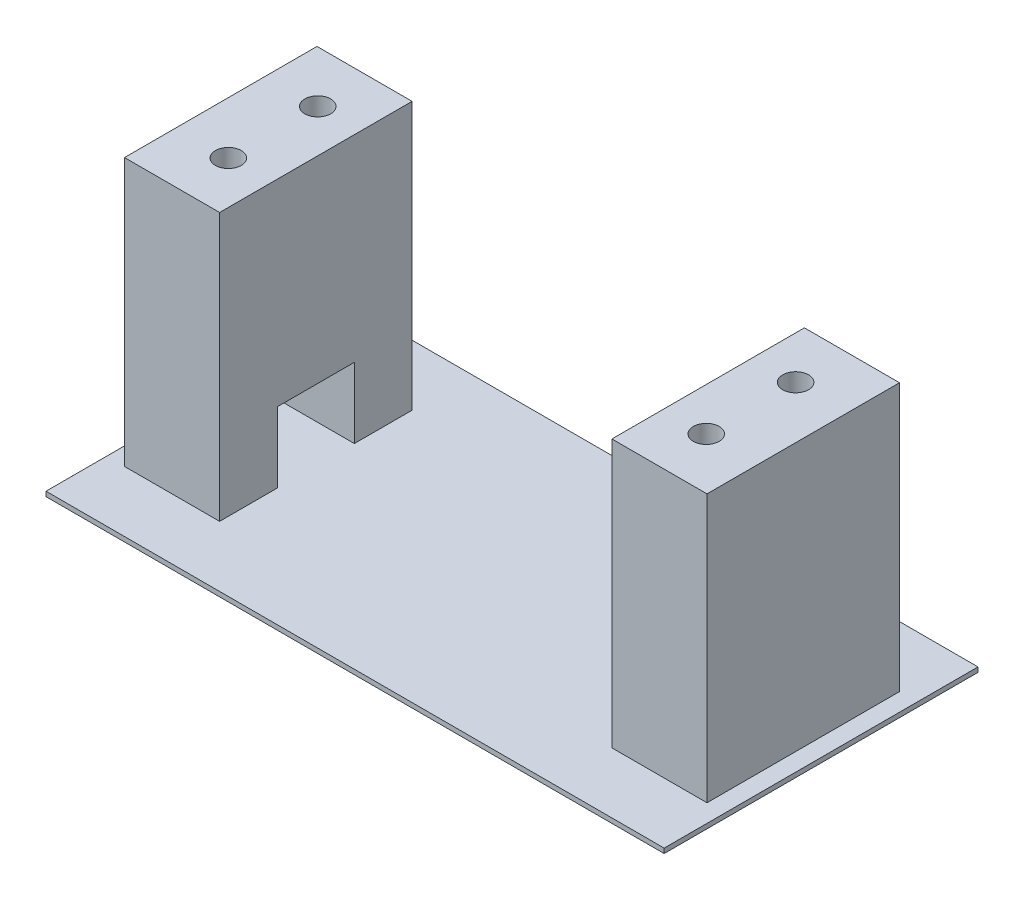
ISO-10303-21;
HEADER;
FILE_DESCRIPTION(('STEP AP214'),'2;1');
FILE_NAME('part.step','',(''),(''),'','','');
FILE_SCHEMA(('AUTOMOTIVE_DESIGN { 1 0 10303 214 1 1 1 1 }'));
ENDSEC;
DATA;
#1=APPLICATION_CONTEXT('core data for automotive mechanical design processes');
#2=APPLICATION_PROTOCOL_DEFINITION('international standard','automotive_design',2000,#1);
#3=PRODUCT_CONTEXT('',#1,'mechanical');
#4=PRODUCT('Part','Part','',(#3));
#5=PRODUCT_RELATED_PRODUCT_CATEGORY('part','',(#4));
#6=PRODUCT_DEFINITION_FORMATION('','',#4);
#7=PRODUCT_DEFINITION_CONTEXT('part definition',#1,'design');
#8=PRODUCT_DEFINITION('design','',#6,#7);
#9=PRODUCT_DEFINITION_SHAPE('','',#8);
#10=(LENGTH_UNIT() NAMED_UNIT(*) SI_UNIT(.MILLI.,.METRE.));
#11=(NAMED_UNIT(*) PLANE_ANGLE_UNIT() SI_UNIT($,.RADIAN.));
#12=(NAMED_UNIT(*) SI_UNIT($,.STERADIAN.) SOLID_ANGLE_UNIT());
#13=UNCERTAINTY_MEASURE_WITH_UNIT(LENGTH_MEASURE(1.E-05),#10,'distance_accuracy_value','');
#14=(GEOMETRIC_REPRESENTATION_CONTEXT(3) GLOBAL_UNCERTAINTY_ASSIGNED_CONTEXT((#13)) GLOBAL_UNIT_ASSIGNED_CONTEXT((#10,
#11,#12)) REPRESENTATION_CONTEXT('',''));
#15=CARTESIAN_POINT('',(0.,0.,0.));
#16=DIRECTION('',(0.,0.,1.));
#17=DIRECTION('',(1.,0.,0.));
#18=AXIS2_PLACEMENT_3D('',#15,#16,#17);
#19=CARTESIAN_POINT('',(0.,0.5,0.));
#20=DIRECTION('',(0.,-1.,0.));
#21=DIRECTION('',(0.,0.,-1.));
#22=AXIS2_PLACEMENT_3D('',#19,#20,#21);
#23=PLANE('',#22);
#24=DIRECTION('',(-1.,0.,0.));
#25=VECTOR('',#24,1.);
#26=CARTESIAN_POINT('',(32.501,0.5,4.05));
#27=LINE('',#26,#25);
#28=CARTESIAN_POINT('',(-20.625,0.5,4.05));
#29=VERTEX_POINT('',#28);
#30=CARTESIAN_POINT('',(-30.625,0.5,4.05));
#31=VERTEX_POINT('',#30);
#32=EDGE_CURVE('E68',#29,#31,#27,.T.);
#33=ORIENTED_EDGE('',*,*,#32,.F.);
#34=DIRECTION('',(0.,0.,1.));
#35=VECTOR('',#34,1.);
#36=CARTESIAN_POINT('',(-20.625,0.5,-10.12));
#37=LINE('',#36,#35);
#38=CARTESIAN_POINT('',(-20.625,0.5,10.12));
#39=VERTEX_POINT('',#38);
#40=EDGE_CURVE('E232',#29,#39,#37,.T.);
#41=ORIENTED_EDGE('',*,*,#40,.T.);
#42=DIRECTION('',(-1.,0.,0.));
#43=VECTOR('',#42,1.);
#44=CARTESIAN_POINT('',(-20.625,0.5,10.12));
#45=LINE('',#44,#43);
#46=CARTESIAN_POINT('',(-30.625,0.5,10.12));
#47=VERTEX_POINT('',#46);
#48=EDGE_CURVE('E228',#39,#47,#45,.T.);
#49=ORIENTED_EDGE('',*,*,#48,.T.);
#50=DIRECTION('',(0.,0.,1.));
#51=VECTOR('',#50,1.);
#52=CARTESIAN_POINT('',(-30.625,0.5,-10.12));
#53=LINE('',#52,#51);
#54=EDGE_CURVE('E240',#31,#47,#53,.T.);
#55=ORIENTED_EDGE('',*,*,#54,.F.);
#56=EDGE_LOOP('',(#33,#41,#49,#55));
#57=FACE_BOUND('',#56,.T.);
#58=CARTESIAN_POINT('',(-20.625,0.5,-10.12));
#59=VERTEX_POINT('',#58);
#60=CARTESIAN_POINT('',(-20.625,0.5,-4.05));
#61=VERTEX_POINT('',#60);
#62=EDGE_CURVE('E233',#59,#61,#37,.T.);
#63=ORIENTED_EDGE('',*,*,#62,.T.);
#64=DIRECTION('',(-1.,0.,0.));
#65=VECTOR('',#64,1.);
#66=CARTESIAN_POINT('',(32.501,0.5,-4.05));
#67=LINE('',#66,#65);
#68=CARTESIAN_POINT('',(-30.625,0.5,-4.05));
#69=VERTEX_POINT('',#68);
#70=EDGE_CURVE('E165',#61,#69,#67,.T.);
#71=ORIENTED_EDGE('',*,*,#70,.T.);
#72=CARTESIAN_POINT('',(-30.625,0.5,-10.12));
#73=VERTEX_POINT('',#72);
#74=EDGE_CURVE('E217',#73,#69,#53,.T.);
#75=ORIENTED_EDGE('',*,*,#74,.F.);
#76=DIRECTION('',(-1.,0.,0.));
#77=VECTOR('',#76,1.);
#78=CARTESIAN_POINT('',(-20.625,0.5,-10.12));
#79=LINE('',#78,#77);
#80=EDGE_CURVE('E236',#59,#73,#79,.T.);
#81=ORIENTED_EDGE('',*,*,#80,.F.);
#82=EDGE_LOOP('',(#63,#71,#75,#81));
#83=FACE_BOUND('',#82,.T.);
#84=DIRECTION('',(0.,0.,-1.));
#85=VECTOR('',#84,1.);
#86=CARTESIAN_POINT('',(32.5,0.5,16.5));
#87=LINE('',#86,#85);
#88=CARTESIAN_POINT('',(32.5,0.5,16.5));
#89=VERTEX_POINT('',#88);
#90=CARTESIAN_POINT('',(32.5,0.5,-16.5));
#91=VERTEX_POINT('',#90);
#92=EDGE_CURVE('E314',#89,#91,#87,.T.);
#93=ORIENTED_EDGE('',*,*,#92,.T.);
#94=DIRECTION('',(-1.,0.,0.));
#95=VECTOR('',#94,1.);
#96=CARTESIAN_POINT('',(-32.5,0.5,-16.5));
#97=LINE('',#96,#95);
#98=CARTESIAN_POINT('',(-32.5,0.5,-16.5));
#99=VERTEX_POINT('',#98);
#100=EDGE_CURVE('E318',#91,#99,#97,.T.);
#101=ORIENTED_EDGE('',*,*,#100,.T.);
#102=DIRECTION('',(0.,0.,1.));
#103=VECTOR('',#102,1.);
#104=CARTESIAN_POINT('',(-32.5,0.5,16.5));
#105=LINE('',#104,#103);
#106=CARTESIAN_POINT('',(-32.5,0.5,16.5));
#107=VERTEX_POINT('',#106);
#108=EDGE_CURVE('E322',#99,#107,#105,.T.);
#109=ORIENTED_EDGE('',*,*,#108,.T.);
#110=DIRECTION('',(1.,0.,0.));
#111=VECTOR('',#110,1.);
#112=CARTESIAN_POINT('',(-32.5,0.5,16.5));
#113=LINE('',#112,#111);
#114=EDGE_CURVE('E325',#107,#89,#113,.T.);
#115=ORIENTED_EDGE('',*,*,#114,.T.);
#116=EDGE_LOOP('',(#93,#101,#109,#115));
#117=FACE_BOUND('',#116,.T.);
#118=DIRECTION('',(1.,0.,0.));
#119=VECTOR('',#118,1.);
#120=CARTESIAN_POINT('',(20.625,0.5,10.12));
#121=LINE('',#120,#119);
#122=CARTESIAN_POINT('',(20.625,0.5,10.12));
#123=VERTEX_POINT('',#122);
#124=CARTESIAN_POINT('',(30.625,0.5,10.12));
#125=VERTEX_POINT('',#124);
#126=EDGE_CURVE('E284',#123,#125,#121,.T.);
#127=ORIENTED_EDGE('',*,*,#126,.F.);
#128=DIRECTION('',(0.,0.,1.));
#129=VECTOR('',#128,1.);
#130=CARTESIAN_POINT('',(20.625,0.5,-10.12));
#131=LINE('',#130,#129);
#132=CARTESIAN_POINT('',(20.625,0.5,-10.12));
#133=VERTEX_POINT('',#132);
#134=EDGE_CURVE('E272',#133,#123,#131,.T.);
#135=ORIENTED_EDGE('',*,*,#134,.F.);
#136=DIRECTION('',(1.,0.,0.));
#137=VECTOR('',#136,1.);
#138=CARTESIAN_POINT('',(20.625,0.5,-10.12));
#139=LINE('',#138,#137);
#140=CARTESIAN_POINT('',(30.625,0.5,-10.12));
#141=VERTEX_POINT('',#140);
#142=EDGE_CURVE('E292',#133,#141,#139,.T.);
#143=ORIENTED_EDGE('',*,*,#142,.T.);
#144=DIRECTION('',(0.,0.,1.));
#145=VECTOR('',#144,1.);
#146=CARTESIAN_POINT('',(30.625,0.5,-10.12));
#147=LINE('',#146,#145);
#148=EDGE_CURVE('E288',#141,#125,#147,.T.);
#149=ORIENTED_EDGE('',*,*,#148,.T.);
#150=EDGE_LOOP('',(#127,#135,#143,#149));
#151=FACE_BOUND('',#150,.T.);
#152=ADVANCED_FACE('F45',(#57,#83,#117,#151),#23,.F.);
#153=CARTESIAN_POINT('',(32.5,0.5,16.5));
#154=DIRECTION('',(-1.,0.,0.));
#155=DIRECTION('',(0.,0.,1.));
#156=AXIS2_PLACEMENT_3D('',#153,#154,#155);
#157=PLANE('',#156);
#158=DIRECTION('',(0.,0.,-1.));
#159=VECTOR('',#158,1.);
#160=CARTESIAN_POINT('',(32.5,0.,16.5));
#161=LINE('',#160,#159);
#162=CARTESIAN_POINT('',(32.5,0.,16.5));
#163=VERTEX_POINT('',#162);
#164=CARTESIAN_POINT('',(32.5,0.,-16.5));
#165=VERTEX_POINT('',#164);
#166=EDGE_CURVE('E313',#163,#165,#161,.T.);
#167=ORIENTED_EDGE('',*,*,#166,.T.);
#168=DIRECTION('',(0.,-1.,0.));
#169=VECTOR('',#168,1.);
#170=CARTESIAN_POINT('',(32.5,0.5,-16.5));
#171=LINE('',#170,#169);
#172=EDGE_CURVE('E11',#91,#165,#171,.T.);
#173=ORIENTED_EDGE('',*,*,#172,.F.);
#174=ORIENTED_EDGE('',*,*,#92,.F.);
#175=DIRECTION('',(0.,-1.,0.));
#176=VECTOR('',#175,1.);
#177=CARTESIAN_POINT('',(32.5,0.5,16.5));
#178=LINE('',#177,#176);
#179=EDGE_CURVE('E328',#89,#163,#178,.T.);
#180=ORIENTED_EDGE('',*,*,#179,.T.);
#181=EDGE_LOOP('',(#167,#173,#174,#180));
#182=FACE_BOUND('',#181,.T.);
#183=ADVANCED_FACE('F47',(#182),#157,.F.);
#184=CARTESIAN_POINT('',(-32.5,0.5,-16.5));
#185=DIRECTION('',(0.,0.,1.));
#186=DIRECTION('',(1.,0.,0.));
#187=AXIS2_PLACEMENT_3D('',#184,#185,#186);
#188=PLANE('',#187);
#189=DIRECTION('',(-1.,0.,0.));
#190=VECTOR('',#189,1.);
#191=CARTESIAN_POINT('',(-32.5,0.,-16.5));
#192=LINE('',#191,#190);
#193=CARTESIAN_POINT('',(-32.5,0.,-16.5));
#194=VERTEX_POINT('',#193);
#195=EDGE_CURVE('E332',#165,#194,#192,.T.);
#196=ORIENTED_EDGE('',*,*,#195,.T.);
#197=DIRECTION('',(0.,-1.,0.));
#198=VECTOR('',#197,1.);
#199=CARTESIAN_POINT('',(-32.5,0.5,-16.5));
#200=LINE('',#199,#198);
#201=EDGE_CURVE('E55',#99,#194,#200,.T.);
#202=ORIENTED_EDGE('',*,*,#201,.F.);
#203=ORIENTED_EDGE('',*,*,#100,.F.);
#204=ORIENTED_EDGE('',*,*,#172,.T.);
#205=EDGE_LOOP('',(#196,#202,#203,#204));
#206=FACE_BOUND('',#205,.T.);
#207=ADVANCED_FACE('F387',(#206),#188,.F.);
#208=CARTESIAN_POINT('',(-32.5,0.5,16.5));
#209=DIRECTION('',(1.,0.,0.));
#210=DIRECTION('',(0.,0.,-1.));
#211=AXIS2_PLACEMENT_3D('',#208,#209,#210);
#212=PLANE('',#211);
#213=DIRECTION('',(0.,0.,1.));
#214=VECTOR('',#213,1.);
#215=CARTESIAN_POINT('',(-32.5,0.,16.5));
#216=LINE('',#215,#214);
#217=CARTESIAN_POINT('',(-32.5,0.,16.5));
#218=VERTEX_POINT('',#217);
#219=EDGE_CURVE('E335',#194,#218,#216,.T.);
#220=ORIENTED_EDGE('',*,*,#219,.T.);
#221=DIRECTION('',(0.,-1.,0.));
#222=VECTOR('',#221,1.);
#223=CARTESIAN_POINT('',(-32.5,0.5,16.5));
#224=LINE('',#223,#222);
#225=EDGE_CURVE('E343',#107,#218,#224,.T.);
#226=ORIENTED_EDGE('',*,*,#225,.F.);
#227=ORIENTED_EDGE('',*,*,#108,.F.);
#228=ORIENTED_EDGE('',*,*,#201,.T.);
#229=EDGE_LOOP('',(#220,#226,#227,#228));
#230=FACE_BOUND('',#229,.T.);
#231=ADVANCED_FACE('F401',(#230),#212,.F.);
#232=CARTESIAN_POINT('',(-32.5,0.5,16.5));
#233=DIRECTION('',(0.,0.,-1.));
#234=DIRECTION('',(-1.,0.,0.));
#235=AXIS2_PLACEMENT_3D('',#232,#233,#234);
#236=PLANE('',#235);
#237=DIRECTION('',(1.,0.,0.));
#238=VECTOR('',#237,1.);
#239=CARTESIAN_POINT('',(-32.5,0.,16.5));
#240=LINE('',#239,#238);
#241=EDGE_CURVE('E319',#218,#163,#240,.T.);
#242=ORIENTED_EDGE('',*,*,#241,.T.);
#243=ORIENTED_EDGE('',*,*,#179,.F.);
#244=ORIENTED_EDGE('',*,*,#114,.F.);
#245=ORIENTED_EDGE('',*,*,#225,.T.);
#246=EDGE_LOOP('',(#242,#243,#244,#245));
#247=FACE_BOUND('',#246,.T.);
#248=ADVANCED_FACE('F397',(#247),#236,.F.);
#249=CARTESIAN_POINT('',(0.,0.,0.));
#250=DIRECTION('',(0.,-1.,0.));
#251=DIRECTION('',(0.,0.,-1.));
#252=AXIS2_PLACEMENT_3D('',#249,#250,#251);
#253=PLANE('',#252);
#254=ORIENTED_EDGE('',*,*,#166,.F.);
#255=ORIENTED_EDGE('',*,*,#241,.F.);
#256=ORIENTED_EDGE('',*,*,#219,.F.);
#257=ORIENTED_EDGE('',*,*,#195,.F.);
#258=EDGE_LOOP('',(#254,#255,#256,#257));
#259=FACE_BOUND('',#258,.T.);
#260=ADVANCED_FACE('F394',(#259),#253,.T.);
#261=CARTESIAN_POINT('',(20.625,28.63,10.12));
#262=DIRECTION('',(0.,0.,-1.));
#263=DIRECTION('',(-1.,0.,0.));
#264=AXIS2_PLACEMENT_3D('',#261,#262,#263);
#265=PLANE('',#264);
#266=ORIENTED_EDGE('',*,*,#126,.T.);
#267=DIRECTION('',(0.,-1.,0.));
#268=VECTOR('',#267,1.);
#269=CARTESIAN_POINT('',(30.625,28.63,10.12));
#270=LINE('',#269,#268);
#271=CARTESIAN_POINT('',(30.625,28.63,10.12));
#272=VERTEX_POINT('',#271);
#273=EDGE_CURVE('E309',#272,#125,#270,.T.);
#274=ORIENTED_EDGE('',*,*,#273,.F.);
#275=DIRECTION('',(1.,0.,0.));
#276=VECTOR('',#275,1.);
#277=CARTESIAN_POINT('',(20.625,28.63,10.12));
#278=LINE('',#277,#276);
#279=CARTESIAN_POINT('',(20.625,28.63,10.12));
#280=VERTEX_POINT('',#279);
#281=EDGE_CURVE('E268',#280,#272,#278,.T.);
#282=ORIENTED_EDGE('',*,*,#281,.F.);
#283=DIRECTION('',(0.,-1.,0.));
#284=VECTOR('',#283,1.);
#285=CARTESIAN_POINT('',(20.625,28.63,10.12));
#286=LINE('',#285,#284);
#287=EDGE_CURVE('E283',#280,#123,#286,.T.);
#288=ORIENTED_EDGE('',*,*,#287,.T.);
#289=EDGE_LOOP('',(#266,#274,#282,#288));
#290=FACE_BOUND('',#289,.T.);
#291=ADVANCED_FACE('F392',(#290),#265,.F.);
#292=CARTESIAN_POINT('',(30.625,28.63,-10.12));
#293=DIRECTION('',(1.,0.,0.));
#294=DIRECTION('',(0.,0.,-1.));
#295=AXIS2_PLACEMENT_3D('',#292,#293,#294);
#296=PLANE('',#295);
#297=ORIENTED_EDGE('',*,*,#148,.F.);
#298=DIRECTION('',(0.,-1.,0.));
#299=VECTOR('',#298,1.);
#300=CARTESIAN_POINT('',(30.625,28.63,-10.12));
#301=LINE('',#300,#299);
#302=CARTESIAN_POINT('',(30.625,28.63,-10.12));
#303=VERTEX_POINT('',#302);
#304=EDGE_CURVE('E305',#303,#141,#301,.T.);
#305=ORIENTED_EDGE('',*,*,#304,.F.);
#306=DIRECTION('',(0.,0.,1.));
#307=VECTOR('',#306,1.);
#308=CARTESIAN_POINT('',(30.625,28.63,-10.12));
#309=LINE('',#308,#307);
#310=EDGE_CURVE('E271',#303,#272,#309,.T.);
#311=ORIENTED_EDGE('',*,*,#310,.T.);
#312=ORIENTED_EDGE('',*,*,#273,.T.);
#313=EDGE_LOOP('',(#297,#305,#311,#312));
#314=FACE_BOUND('',#313,.T.);
#315=ADVANCED_FACE('F437',(#314),#296,.T.);
#316=CARTESIAN_POINT('',(20.625,28.63,-10.12));
#317=DIRECTION('',(0.,0.,-1.));
#318=DIRECTION('',(-1.,0.,0.));
#319=AXIS2_PLACEMENT_3D('',#316,#317,#318);
#320=PLANE('',#319);
#321=ORIENTED_EDGE('',*,*,#142,.F.);
#322=DIRECTION('',(0.,-1.,0.));
#323=VECTOR('',#322,1.);
#324=CARTESIAN_POINT('',(20.625,28.63,-10.12));
#325=LINE('',#324,#323);
#326=CARTESIAN_POINT('',(20.625,28.63,-10.12));
#327=VERTEX_POINT('',#326);
#328=EDGE_CURVE('E301',#327,#133,#325,.T.);
#329=ORIENTED_EDGE('',*,*,#328,.F.);
#330=DIRECTION('',(1.,0.,0.));
#331=VECTOR('',#330,1.);
#332=CARTESIAN_POINT('',(20.625,28.63,-10.12));
#333=LINE('',#332,#331);
#334=EDGE_CURVE('E276',#327,#303,#333,.T.);
#335=ORIENTED_EDGE('',*,*,#334,.T.);
#336=ORIENTED_EDGE('',*,*,#304,.T.);
#337=EDGE_LOOP('',(#321,#329,#335,#336));
#338=FACE_BOUND('',#337,.T.);
#339=ADVANCED_FACE('F435',(#338),#320,.T.);
#340=CARTESIAN_POINT('',(20.625,28.63,-10.12));
#341=DIRECTION('',(1.,0.,0.));
#342=DIRECTION('',(0.,0.,-1.));
#343=AXIS2_PLACEMENT_3D('',#340,#341,#342);
#344=PLANE('',#343);
#345=ORIENTED_EDGE('',*,*,#134,.T.);
#346=ORIENTED_EDGE('',*,*,#287,.F.);
#347=DIRECTION('',(0.,0.,1.));
#348=VECTOR('',#347,1.);
#349=CARTESIAN_POINT('',(20.625,28.63,-10.12));
#350=LINE('',#349,#348);
#351=EDGE_CURVE('E280',#327,#280,#350,.T.);
#352=ORIENTED_EDGE('',*,*,#351,.F.);
#353=ORIENTED_EDGE('',*,*,#328,.T.);
#354=EDGE_LOOP('',(#345,#346,#352,#353));
#355=FACE_BOUND('',#354,.T.);
#356=ADVANCED_FACE('F426',(#355),#344,.F.);
#357=CARTESIAN_POINT('',(0.,28.63,0.));
#358=DIRECTION('',(0.,-1.,0.));
#359=DIRECTION('',(0.,0.,-1.));
#360=AXIS2_PLACEMENT_3D('',#357,#358,#359);
#361=PLANE('',#360);
#362=CARTESIAN_POINT('',(25.125,28.63,-4.7));
#363=DIRECTION('',(0.,-1.,0.));
#364=DIRECTION('',(0.,0.,-1.));
#365=AXIS2_PLACEMENT_3D('',#362,#363,#364);
#366=CIRCLE('',#365,1.36107779506048);
#367=CARTESIAN_POINT('',(25.125,28.63,-6.06107779506048));
#368=VERTEX_POINT('',#367);
#369=EDGE_CURVE('E289',#368,#368,#366,.F.);
#370=ORIENTED_EDGE('',*,*,#369,.F.);
#371=EDGE_LOOP('',(#370));
#372=FACE_BOUND('',#371,.T.);
#373=CARTESIAN_POINT('',(25.125,28.63,4.7));
#374=DIRECTION('',(0.,-1.,0.));
#375=DIRECTION('',(0.,0.,-1.));
#376=AXIS2_PLACEMENT_3D('',#373,#374,#375);
#377=CIRCLE('',#376,1.36107779506048);
#378=CARTESIAN_POINT('',(25.125,28.63,3.33892220493952));
#379=VERTEX_POINT('',#378);
#380=EDGE_CURVE('E264',#379,#379,#377,.F.);
#381=ORIENTED_EDGE('',*,*,#380,.F.);
#382=EDGE_LOOP('',(#381));
#383=FACE_BOUND('',#382,.T.);
#384=ORIENTED_EDGE('',*,*,#281,.T.);
#385=ORIENTED_EDGE('',*,*,#310,.F.);
#386=ORIENTED_EDGE('',*,*,#334,.F.);
#387=ORIENTED_EDGE('',*,*,#351,.T.);
#388=EDGE_LOOP('',(#384,#385,#386,#387));
#389=FACE_BOUND('',#388,.T.);
#390=ADVANCED_FACE('F432',(#372,#383,#389),#361,.F.);
#391=CARTESIAN_POINT('',(25.125,28.630012,4.7));
#392=DIRECTION('',(0.,-1.,0.));
#393=DIRECTION('',(0.,0.,-1.));
#394=AXIS2_PLACEMENT_3D('',#391,#392,#393);
#395=CYLINDRICAL_SURFACE('',#394,1.36107779506048);
#396=CARTESIAN_POINT('',(25.125,18.63,4.7));
#397=DIRECTION('',(0.,1.,0.));
#398=DIRECTION('',(0.,0.,-1.));
#399=AXIS2_PLACEMENT_3D('',#396,#397,#398);
#400=CIRCLE('',#399,1.36107779506048);
#401=CARTESIAN_POINT('',(25.125,18.63,3.33892220493952));
#402=VERTEX_POINT('',#401);
#403=EDGE_CURVE('E259',#402,#402,#400,.T.);
#404=CARTESIAN_POINT('',(25.125,18.63,3.33892220493952));
#405=CARTESIAN_POINT('',(25.125,18.7341666666667,3.33892220493952));
#406=CARTESIAN_POINT('',(25.125,18.8383333333333,3.33892220493952));
#407=CARTESIAN_POINT('',(25.125,19.0466666666667,3.33892220493952));
#408=CARTESIAN_POINT('',(25.125,19.1508333333333,3.33892220493952));
#409=CARTESIAN_POINT('',(25.125,19.3591666666667,3.33892220493952));
#410=CARTESIAN_POINT('',(25.125,19.4633333333333,3.33892220493952));
#411=CARTESIAN_POINT('',(25.125,19.6716666666667,3.33892220493952));
#412=CARTESIAN_POINT('',(25.125,19.7758333333333,3.33892220493952));
#413=CARTESIAN_POINT('',(25.125,19.9841666666667,3.33892220493952));
#414=CARTESIAN_POINT('',(25.125,20.0883333333333,3.33892220493952));
#415=CARTESIAN_POINT('',(25.125,20.2966666666667,3.33892220493952));
#416=CARTESIAN_POINT('',(25.125,20.4008333333333,3.33892220493952));
#417=CARTESIAN_POINT('',(25.125,20.6091666666667,3.33892220493952));
#418=CARTESIAN_POINT('',(25.125,20.7133333333333,3.33892220493952));
#419=CARTESIAN_POINT('',(25.125,20.9216666666667,3.33892220493952));
#420=CARTESIAN_POINT('',(25.125,21.0258333333333,3.33892220493952));
#421=CARTESIAN_POINT('',(25.125,21.2341666666667,3.33892220493952));
#422=CARTESIAN_POINT('',(25.125,21.3383333333333,3.33892220493952));
#423=CARTESIAN_POINT('',(25.125,21.5466666666667,3.33892220493952));
#424=CARTESIAN_POINT('',(25.125,21.6508333333333,3.33892220493952));
#425=CARTESIAN_POINT('',(25.125,21.8591666666667,3.33892220493952));
#426=CARTESIAN_POINT('',(25.125,21.9633333333333,3.33892220493952));
#427=CARTESIAN_POINT('',(25.125,22.1716666666667,3.33892220493952));
#428=CARTESIAN_POINT('',(25.125,22.2758333333333,3.33892220493952));
#429=CARTESIAN_POINT('',(25.125,22.4841666666667,3.33892220493952));
#430=CARTESIAN_POINT('',(25.125,22.5883333333333,3.33892220493952));
#431=CARTESIAN_POINT('',(25.125,22.7966666666667,3.33892220493952));
#432=CARTESIAN_POINT('',(25.125,22.9008333333333,3.33892220493952));
#433=CARTESIAN_POINT('',(25.125,23.1091666666667,3.33892220493952));
#434=CARTESIAN_POINT('',(25.125,23.2133333333333,3.33892220493952));
#435=CARTESIAN_POINT('',(25.125,23.4216666666667,3.33892220493952));
#436=CARTESIAN_POINT('',(25.125,23.5258333333333,3.33892220493952));
#437=CARTESIAN_POINT('',(25.125,23.7341666666667,3.33892220493952));
#438=CARTESIAN_POINT('',(25.125,23.8383333333333,3.33892220493952));
#439=CARTESIAN_POINT('',(25.125,24.0466666666667,3.33892220493952));
#440=CARTESIAN_POINT('',(25.125,24.1508333333333,3.33892220493952));
#441=CARTESIAN_POINT('',(25.125,24.3591666666667,3.33892220493952));
#442=CARTESIAN_POINT('',(25.125,24.4633333333333,3.33892220493952));
#443=CARTESIAN_POINT('',(25.125,24.6716666666667,3.33892220493952));
#444=CARTESIAN_POINT('',(25.125,24.7758333333333,3.33892220493952));
#445=CARTESIAN_POINT('',(25.125,24.9841666666667,3.33892220493952));
#446=CARTESIAN_POINT('',(25.125,25.0883333333333,3.33892220493952));
#447=CARTESIAN_POINT('',(25.125,25.2966666666667,3.33892220493952));
#448=CARTESIAN_POINT('',(25.125,25.4008333333333,3.33892220493952));
#449=CARTESIAN_POINT('',(25.125,25.6091666666667,3.33892220493952));
#450=CARTESIAN_POINT('',(25.125,25.7133333333333,3.33892220493952));
#451=CARTESIAN_POINT('',(25.125,25.9216666666667,3.33892220493952));
#452=CARTESIAN_POINT('',(25.125,26.0258333333333,3.33892220493952));
#453=CARTESIAN_POINT('',(25.125,26.2341666666667,3.33892220493952));
#454=CARTESIAN_POINT('',(25.125,26.3383333333333,3.33892220493952));
#455=CARTESIAN_POINT('',(25.125,26.5466666666667,3.33892220493952));
#456=CARTESIAN_POINT('',(25.125,26.6508333333333,3.33892220493952));
#457=CARTESIAN_POINT('',(25.125,26.8591666666667,3.33892220493952));
#458=CARTESIAN_POINT('',(25.125,26.9633333333333,3.33892220493952));
#459=CARTESIAN_POINT('',(25.125,27.1716666666667,3.33892220493952));
#460=CARTESIAN_POINT('',(25.125,27.2758333333333,3.33892220493952));
#461=CARTESIAN_POINT('',(25.125,27.4841666666667,3.33892220493952));
#462=CARTESIAN_POINT('',(25.125,27.5883333333333,3.33892220493952));
#463=CARTESIAN_POINT('',(25.125,27.7966666666667,3.33892220493952));
#464=CARTESIAN_POINT('',(25.125,27.9008333333333,3.33892220493952));
#465=CARTESIAN_POINT('',(25.125,28.1091666666667,3.33892220493952));
#466=CARTESIAN_POINT('',(25.125,28.2133333333333,3.33892220493952));
#467=CARTESIAN_POINT('',(25.125,28.4216666666667,3.33892220493952));
#468=CARTESIAN_POINT('',(25.125,28.5258333333333,3.33892220493952));
#469=CARTESIAN_POINT('',(25.125,28.63,3.33892220493952));
#470=B_SPLINE_CURVE_WITH_KNOTS('',3,(#404,#405,#406,#407,#408,#409,#410,#411,#412,#413,#414,
#415,#416,#417,#418,#419,#420,#421,#422,#423,#424,#425,#426,#427,#428,#429,#430,#431,#432,#433,
#434,#435,#436,#437,#438,#439,#440,#441,#442,#443,#444,#445,#446,#447,#448,#449,#450,#451,#452,
#453,#454,#455,#456,#457,#458,#459,#460,#461,#462,#463,#464,#465,#466,#467,#468,#469),
.UNSPECIFIED.,.F.,.F.,(4,2,2,2,2,2,2,2,2,2,2,2,2,2,2,2,2,2,2,2,2,2,2,2,2,2,2,2,2,2,2,2,4),(0.,
0.3125,0.625000000000001,0.937500000000001,1.25,1.5625,1.875,2.1875,2.5,2.8125,3.125,3.4375,
3.75,4.0625,4.375,4.6875,5.,5.3125,5.625,5.9375,6.25,6.5625,6.875,7.1875,7.5,7.8125,8.125,
8.4375,8.75,9.0625,9.375,9.6875,10.),.UNSPECIFIED.);
#471=EDGE_CURVE('BSEAM449',#402,#379,#470,.T.);
#472=ORIENTED_EDGE('',*,*,#403,.F.);
#473=ORIENTED_EDGE('',*,*,#380,.T.);
#474=ORIENTED_EDGE('',*,*,#471,.T.);
#475=ORIENTED_EDGE('',*,*,#471,.F.);
#476=EDGE_LOOP('',(#472,#474,#473,#475));
#477=FACE_BOUND('',#476,.T.);
#478=ADVANCED_FACE('F449',(#477),#395,.F.);
#479=CARTESIAN_POINT('',(25.125,18.63,4.7));
#480=DIRECTION('',(0.,-1.,0.));
#481=DIRECTION('',(0.,0.,-1.));
#482=AXIS2_PLACEMENT_3D('',#479,#480,#481);
#483=PLANE('',#482);
#484=ORIENTED_EDGE('',*,*,#403,.T.);
#485=EDGE_LOOP('',(#484));
#486=FACE_BOUND('',#485,.T.);
#487=ADVANCED_FACE('F451',(#486),#483,.F.);
#488=CARTESIAN_POINT('',(25.125,28.630012,-4.7));
#489=DIRECTION('',(0.,-1.,0.));
#490=DIRECTION('',(0.,0.,-1.));
#491=AXIS2_PLACEMENT_3D('',#488,#489,#490);
#492=CYLINDRICAL_SURFACE('',#491,1.36107779506048);
#493=CARTESIAN_POINT('',(25.125,18.63,-4.7));
#494=DIRECTION('',(0.,1.,0.));
#495=DIRECTION('',(0.,0.,1.));
#496=AXIS2_PLACEMENT_3D('',#493,#494,#495);
#497=CIRCLE('',#496,1.36107779506048);
#498=CARTESIAN_POINT('',(25.125,18.63,-6.06107779506048));
#499=VERTEX_POINT('',#498);
#500=EDGE_CURVE('E260',#499,#499,#497,.T.);
#501=CARTESIAN_POINT('',(25.125,18.63,-6.06107779506048));
#502=CARTESIAN_POINT('',(25.125,18.7341666666667,-6.06107779506048));
#503=CARTESIAN_POINT('',(25.125,18.8383333333333,-6.06107779506048));
#504=CARTESIAN_POINT('',(25.125,19.0466666666667,-6.06107779506048));
#505=CARTESIAN_POINT('',(25.125,19.1508333333333,-6.06107779506048));
#506=CARTESIAN_POINT('',(25.125,19.3591666666667,-6.06107779506048));
#507=CARTESIAN_POINT('',(25.125,19.4633333333333,-6.06107779506048));
#508=CARTESIAN_POINT('',(25.125,19.6716666666667,-6.06107779506048));
#509=CARTESIAN_POINT('',(25.125,19.7758333333333,-6.06107779506048));
#510=CARTESIAN_POINT('',(25.125,19.9841666666667,-6.06107779506048));
#511=CARTESIAN_POINT('',(25.125,20.0883333333333,-6.06107779506048));
#512=CARTESIAN_POINT('',(25.125,20.2966666666667,-6.06107779506048));
#513=CARTESIAN_POINT('',(25.125,20.4008333333333,-6.06107779506048));
#514=CARTESIAN_POINT('',(25.125,20.6091666666667,-6.06107779506048));
#515=CARTESIAN_POINT('',(25.125,20.7133333333333,-6.06107779506048));
#516=CARTESIAN_POINT('',(25.125,20.9216666666667,-6.06107779506048));
#517=CARTESIAN_POINT('',(25.125,21.0258333333333,-6.06107779506048));
#518=CARTESIAN_POINT('',(25.125,21.2341666666667,-6.06107779506048));
#519=CARTESIAN_POINT('',(25.125,21.3383333333333,-6.06107779506048));
#520=CARTESIAN_POINT('',(25.125,21.5466666666667,-6.06107779506048));
#521=CARTESIAN_POINT('',(25.125,21.6508333333333,-6.06107779506048));
#522=CARTESIAN_POINT('',(25.125,21.8591666666667,-6.06107779506048));
#523=CARTESIAN_POINT('',(25.125,21.9633333333333,-6.06107779506048));
#524=CARTESIAN_POINT('',(25.125,22.1716666666667,-6.06107779506048));
#525=CARTESIAN_POINT('',(25.125,22.2758333333333,-6.06107779506048));
#526=CARTESIAN_POINT('',(25.125,22.4841666666667,-6.06107779506048));
#527=CARTESIAN_POINT('',(25.125,22.5883333333333,-6.06107779506048));
#528=CARTESIAN_POINT('',(25.125,22.7966666666667,-6.06107779506048));
#529=CARTESIAN_POINT('',(25.125,22.9008333333333,-6.06107779506048));
#530=CARTESIAN_POINT('',(25.125,23.1091666666667,-6.06107779506048));
#531=CARTESIAN_POINT('',(25.125,23.2133333333333,-6.06107779506048));
#532=CARTESIAN_POINT('',(25.125,23.4216666666667,-6.06107779506048));
#533=CARTESIAN_POINT('',(25.125,23.5258333333333,-6.06107779506048));
#534=CARTESIAN_POINT('',(25.125,23.7341666666667,-6.06107779506048));
#535=CARTESIAN_POINT('',(25.125,23.8383333333333,-6.06107779506048));
#536=CARTESIAN_POINT('',(25.125,24.0466666666667,-6.06107779506048));
#537=CARTESIAN_POINT('',(25.125,24.1508333333333,-6.06107779506048));
#538=CARTESIAN_POINT('',(25.125,24.3591666666667,-6.06107779506048));
#539=CARTESIAN_POINT('',(25.125,24.4633333333333,-6.06107779506048));
#540=CARTESIAN_POINT('',(25.125,24.6716666666667,-6.06107779506048));
#541=CARTESIAN_POINT('',(25.125,24.7758333333333,-6.06107779506048));
#542=CARTESIAN_POINT('',(25.125,24.9841666666667,-6.06107779506048));
#543=CARTESIAN_POINT('',(25.125,25.0883333333333,-6.06107779506048));
#544=CARTESIAN_POINT('',(25.125,25.2966666666667,-6.06107779506048));
#545=CARTESIAN_POINT('',(25.125,25.4008333333333,-6.06107779506048));
#546=CARTESIAN_POINT('',(25.125,25.6091666666667,-6.06107779506048));
#547=CARTESIAN_POINT('',(25.125,25.7133333333333,-6.06107779506048));
#548=CARTESIAN_POINT('',(25.125,25.9216666666667,-6.06107779506048));
#549=CARTESIAN_POINT('',(25.125,26.0258333333333,-6.06107779506048));
#550=CARTESIAN_POINT('',(25.125,26.2341666666667,-6.06107779506048));
#551=CARTESIAN_POINT('',(25.125,26.3383333333333,-6.06107779506048));
#552=CARTESIAN_POINT('',(25.125,26.5466666666667,-6.06107779506048));
#553=CARTESIAN_POINT('',(25.125,26.6508333333333,-6.06107779506048));
#554=CARTESIAN_POINT('',(25.125,26.8591666666667,-6.06107779506048));
#555=CARTESIAN_POINT('',(25.125,26.9633333333333,-6.06107779506048));
#556=CARTESIAN_POINT('',(25.125,27.1716666666667,-6.06107779506048));
#557=CARTESIAN_POINT('',(25.125,27.2758333333333,-6.06107779506048));
#558=CARTESIAN_POINT('',(25.125,27.4841666666667,-6.06107779506048));
#559=CARTESIAN_POINT('',(25.125,27.5883333333333,-6.06107779506048));
#560=CARTESIAN_POINT('',(25.125,27.7966666666667,-6.06107779506048));
#561=CARTESIAN_POINT('',(25.125,27.9008333333333,-6.06107779506048));
#562=CARTESIAN_POINT('',(25.125,28.1091666666667,-6.06107779506048));
#563=CARTESIAN_POINT('',(25.125,28.2133333333333,-6.06107779506048));
#564=CARTESIAN_POINT('',(25.125,28.4216666666667,-6.06107779506048));
#565=CARTESIAN_POINT('',(25.125,28.5258333333333,-6.06107779506048));
#566=CARTESIAN_POINT('',(25.125,28.63,-6.06107779506048));
#567=B_SPLINE_CURVE_WITH_KNOTS('',3,(#501,#502,#503,#504,#505,#506,#507,#508,#509,#510,#511,
#512,#513,#514,#515,#516,#517,#518,#519,#520,#521,#522,#523,#524,#525,#526,#527,#528,#529,#530,
#531,#532,#533,#534,#535,#536,#537,#538,#539,#540,#541,#542,#543,#544,#545,#546,#547,#548,#549,
#550,#551,#552,#553,#554,#555,#556,#557,#558,#559,#560,#561,#562,#563,#564,#565,#566),
.UNSPECIFIED.,.F.,.F.,(4,2,2,2,2,2,2,2,2,2,2,2,2,2,2,2,2,2,2,2,2,2,2,2,2,2,2,2,2,2,2,2,4),(0.,
0.3125,0.625000000000001,0.937500000000001,1.25,1.5625,1.875,2.1875,2.5,2.8125,3.125,3.4375,
3.75,4.0625,4.375,4.6875,5.,5.3125,5.625,5.9375,6.25,6.5625,6.875,7.1875,7.5,7.8125,8.125,
8.4375,8.75,9.0625,9.375,9.6875,10.),.UNSPECIFIED.);
#568=EDGE_CURVE('BSEAM454',#499,#368,#567,.T.);
#569=ORIENTED_EDGE('',*,*,#500,.F.);
#570=ORIENTED_EDGE('',*,*,#369,.T.);
#571=ORIENTED_EDGE('',*,*,#568,.T.);
#572=ORIENTED_EDGE('',*,*,#568,.F.);
#573=EDGE_LOOP('',(#569,#571,#570,#572));
#574=FACE_BOUND('',#573,.T.);
#575=ADVANCED_FACE('F454',(#574),#492,.F.);
#576=CARTESIAN_POINT('',(25.125,18.63,-4.7));
#577=DIRECTION('',(0.,1.,0.));
#578=DIRECTION('',(0.,0.,1.));
#579=AXIS2_PLACEMENT_3D('',#576,#577,#578);
#580=PLANE('',#579);
#581=ORIENTED_EDGE('',*,*,#500,.T.);
#582=EDGE_LOOP('',(#581));
#583=FACE_BOUND('',#582,.T.);
#584=ADVANCED_FACE('F461',(#583),#580,.T.);
#585=CARTESIAN_POINT('',(-20.625,28.63,10.12));
#586=DIRECTION('',(0.,0.,1.));
#587=DIRECTION('',(1.,0.,0.));
#588=AXIS2_PLACEMENT_3D('',#585,#586,#587);
#589=PLANE('',#588);
#590=ORIENTED_EDGE('',*,*,#48,.F.);
#591=DIRECTION('',(0.,-1.,0.));
#592=VECTOR('',#591,1.);
#593=CARTESIAN_POINT('',(-20.625,28.63,10.12));
#594=LINE('',#593,#592);
#595=CARTESIAN_POINT('',(-20.625,28.63,10.12));
#596=VERTEX_POINT('',#595);
#597=EDGE_CURVE('E255',#596,#39,#594,.T.);
#598=ORIENTED_EDGE('',*,*,#597,.F.);
#599=DIRECTION('',(-1.,0.,0.));
#600=VECTOR('',#599,1.);
#601=CARTESIAN_POINT('',(-20.625,28.63,10.12));
#602=LINE('',#601,#600);
#603=CARTESIAN_POINT('',(-30.625,28.63,10.12));
#604=VERTEX_POINT('',#603);
#605=EDGE_CURVE('E212',#596,#604,#602,.T.);
#606=ORIENTED_EDGE('',*,*,#605,.T.);
#607=DIRECTION('',(0.,-1.,0.));
#608=VECTOR('',#607,1.);
#609=CARTESIAN_POINT('',(-30.625,28.63,10.12));
#610=LINE('',#609,#608);
#611=EDGE_CURVE('E227',#604,#47,#610,.T.);
#612=ORIENTED_EDGE('',*,*,#611,.T.);
#613=EDGE_LOOP('',(#590,#598,#606,#612));
#614=FACE_BOUND('',#613,.T.);
#615=ADVANCED_FACE('F465',(#614),#589,.T.);
#616=CARTESIAN_POINT('',(-20.625,28.63,-10.12));
#617=DIRECTION('',(1.,0.,0.));
#618=DIRECTION('',(0.,0.,-1.));
#619=AXIS2_PLACEMENT_3D('',#616,#617,#618);
#620=PLANE('',#619);
#621=DIRECTION('',(0.,-1.,0.));
#622=VECTOR('',#621,1.);
#623=CARTESIAN_POINT('',(-20.625,7.9,-4.05));
#624=LINE('',#623,#622);
#625=CARTESIAN_POINT('',(-20.625,7.9,-4.05));
#626=VERTEX_POINT('',#625);
#627=EDGE_CURVE('E159',#626,#61,#624,.T.);
#628=ORIENTED_EDGE('',*,*,#627,.T.);
#629=ORIENTED_EDGE('',*,*,#62,.F.);
#630=DIRECTION('',(0.,-1.,0.));
#631=VECTOR('',#630,1.);
#632=CARTESIAN_POINT('',(-20.625,28.63,-10.12));
#633=LINE('',#632,#631);
#634=CARTESIAN_POINT('',(-20.625,28.63,-10.12));
#635=VERTEX_POINT('',#634);
#636=EDGE_CURVE('E251',#635,#59,#633,.T.);
#637=ORIENTED_EDGE('',*,*,#636,.F.);
#638=DIRECTION('',(0.,0.,1.));
#639=VECTOR('',#638,1.);
#640=CARTESIAN_POINT('',(-20.625,28.63,-10.12));
#641=LINE('',#640,#639);
#642=EDGE_CURVE('E216',#635,#596,#641,.T.);
#643=ORIENTED_EDGE('',*,*,#642,.T.);
#644=ORIENTED_EDGE('',*,*,#597,.T.);
#645=ORIENTED_EDGE('',*,*,#40,.F.);
#646=DIRECTION('',(0.,1.,0.));
#647=VECTOR('',#646,1.);
#648=CARTESIAN_POINT('',(-20.625,7.9,4.05));
#649=LINE('',#648,#647);
#650=CARTESIAN_POINT('',(-20.625,7.9,4.05));
#651=VERTEX_POINT('',#650);
#652=EDGE_CURVE('E183',#29,#651,#649,.T.);
#653=ORIENTED_EDGE('',*,*,#652,.T.);
#654=DIRECTION('',(0.,0.,-1.));
#655=VECTOR('',#654,1.);
#656=CARTESIAN_POINT('',(-20.625,7.9,-4.05));
#657=LINE('',#656,#655);
#658=EDGE_CURVE('E174',#651,#626,#657,.T.);
#659=ORIENTED_EDGE('',*,*,#658,.T.);
#660=EDGE_LOOP('',(#628,#629,#637,#643,#644,#645,#653,#659));
#661=FACE_BOUND('',#660,.T.);
#662=ADVANCED_FACE('F181',(#661),#620,.T.);
#663=CARTESIAN_POINT('',(-20.625,28.63,-10.12));
#664=DIRECTION('',(0.,0.,1.));
#665=DIRECTION('',(1.,0.,0.));
#666=AXIS2_PLACEMENT_3D('',#663,#664,#665);
#667=PLANE('',#666);
#668=ORIENTED_EDGE('',*,*,#80,.T.);
#669=DIRECTION('',(0.,-1.,0.));
#670=VECTOR('',#669,1.);
#671=CARTESIAN_POINT('',(-30.625,28.63,-10.12));
#672=LINE('',#671,#670);
#673=CARTESIAN_POINT('',(-30.625,28.63,-10.12));
#674=VERTEX_POINT('',#673);
#675=EDGE_CURVE('E247',#674,#73,#672,.T.);
#676=ORIENTED_EDGE('',*,*,#675,.F.);
#677=DIRECTION('',(-1.,0.,0.));
#678=VECTOR('',#677,1.);
#679=CARTESIAN_POINT('',(-20.625,28.63,-10.12));
#680=LINE('',#679,#678);
#681=EDGE_CURVE('E221',#635,#674,#680,.T.);
#682=ORIENTED_EDGE('',*,*,#681,.F.);
#683=ORIENTED_EDGE('',*,*,#636,.T.);
#684=EDGE_LOOP('',(#668,#676,#682,#683));
#685=FACE_BOUND('',#684,.T.);
#686=ADVANCED_FACE('F471',(#685),#667,.F.);
#687=CARTESIAN_POINT('',(-30.625,28.63,-10.12));
#688=DIRECTION('',(1.,0.,0.));
#689=DIRECTION('',(0.,0.,-1.));
#690=AXIS2_PLACEMENT_3D('',#687,#688,#689);
#691=PLANE('',#690);
#692=ORIENTED_EDGE('',*,*,#74,.T.);
#693=DIRECTION('',(0.,-1.,0.));
#694=VECTOR('',#693,1.);
#695=CARTESIAN_POINT('',(-30.625,7.9,-4.05));
#696=LINE('',#695,#694);
#697=CARTESIAN_POINT('',(-30.625,7.9,-4.05));
#698=VERTEX_POINT('',#697);
#699=EDGE_CURVE('E185',#698,#69,#696,.T.);
#700=ORIENTED_EDGE('',*,*,#699,.F.);
#701=DIRECTION('',(0.,0.,-1.));
#702=VECTOR('',#701,1.);
#703=CARTESIAN_POINT('',(-30.625,7.9,-4.05));
#704=LINE('',#703,#702);
#705=CARTESIAN_POINT('',(-30.625,7.9,4.05));
#706=VERTEX_POINT('',#705);
#707=EDGE_CURVE('E177',#706,#698,#704,.T.);
#708=ORIENTED_EDGE('',*,*,#707,.F.);
#709=DIRECTION('',(0.,1.,0.));
#710=VECTOR('',#709,1.);
#711=CARTESIAN_POINT('',(-30.625,7.9,4.05));
#712=LINE('',#711,#710);
#713=EDGE_CURVE('E192',#31,#706,#712,.T.);
#714=ORIENTED_EDGE('',*,*,#713,.F.);
#715=ORIENTED_EDGE('',*,*,#54,.T.);
#716=ORIENTED_EDGE('',*,*,#611,.F.);
#717=DIRECTION('',(0.,0.,1.));
#718=VECTOR('',#717,1.);
#719=CARTESIAN_POINT('',(-30.625,28.63,-10.12));
#720=LINE('',#719,#718);
#721=EDGE_CURVE('E224',#674,#604,#720,.T.);
#722=ORIENTED_EDGE('',*,*,#721,.F.);
#723=ORIENTED_EDGE('',*,*,#675,.T.);
#724=EDGE_LOOP('',(#692,#700,#708,#714,#715,#716,#722,#723));
#725=FACE_BOUND('',#724,.T.);
#726=ADVANCED_FACE('F474',(#725),#691,.F.);
#727=CARTESIAN_POINT('',(0.,28.63,0.));
#728=DIRECTION('',(0.,-1.,0.));
#729=DIRECTION('',(0.,0.,-1.));
#730=AXIS2_PLACEMENT_3D('',#727,#728,#729);
#731=PLANE('',#730);
#732=CARTESIAN_POINT('',(-25.125,28.63,-4.7));
#733=DIRECTION('',(0.,-1.,0.));
#734=DIRECTION('',(0.,0.,-1.));
#735=AXIS2_PLACEMENT_3D('',#732,#733,#734);
#736=CIRCLE('',#735,1.36107779506048);
#737=CARTESIAN_POINT('',(-25.125,28.63,-6.06107779506048));
#738=VERTEX_POINT('',#737);
#739=EDGE_CURVE('E49',#738,#738,#736,.T.);
#740=ORIENTED_EDGE('',*,*,#739,.T.);
#741=EDGE_LOOP('',(#740));
#742=FACE_BOUND('',#741,.T.);
#743=CARTESIAN_POINT('',(-25.125,28.63,4.7));
#744=DIRECTION('',(0.,-1.,0.));
#745=DIRECTION('',(0.,0.,-1.));
#746=AXIS2_PLACEMENT_3D('',#743,#744,#745);
#747=CIRCLE('',#746,1.36107779506048);
#748=CARTESIAN_POINT('',(-25.125,28.63,3.33892220493952));
#749=VERTEX_POINT('',#748);
#750=EDGE_CURVE('E208',#749,#749,#747,.T.);
#751=ORIENTED_EDGE('',*,*,#750,.T.);
#752=EDGE_LOOP('',(#751));
#753=FACE_BOUND('',#752,.T.);
#754=ORIENTED_EDGE('',*,*,#605,.F.);
#755=ORIENTED_EDGE('',*,*,#642,.F.);
#756=ORIENTED_EDGE('',*,*,#681,.T.);
#757=ORIENTED_EDGE('',*,*,#721,.T.);
#758=EDGE_LOOP('',(#754,#755,#756,#757));
#759=FACE_BOUND('',#758,.T.);
#760=ADVANCED_FACE('F363',(#742,#753,#759),#731,.F.);
#761=CARTESIAN_POINT('',(-25.125,28.630012,4.7));
#762=DIRECTION('',(0.,-1.,0.));
#763=DIRECTION('',(0.,0.,-1.));
#764=AXIS2_PLACEMENT_3D('',#761,#762,#763);
#765=CYLINDRICAL_SURFACE('',#764,1.36107779506048);
#766=CARTESIAN_POINT('',(-25.125,18.63,4.7));
#767=DIRECTION('',(0.,-1.,0.));
#768=DIRECTION('',(0.,0.,-1.));
#769=AXIS2_PLACEMENT_3D('',#766,#767,#768);
#770=CIRCLE('',#769,1.36107779506048);
#771=CARTESIAN_POINT('',(-25.125,18.63,3.33892220493952));
#772=VERTEX_POINT('',#771);
#773=EDGE_CURVE('E203',#772,#772,#770,.T.);
#774=CARTESIAN_POINT('',(-25.125,18.63,3.33892220493952));
#775=CARTESIAN_POINT('',(-25.125,18.7341666666667,3.33892220493952));
#776=CARTESIAN_POINT('',(-25.125,18.8383333333333,3.33892220493952));
#777=CARTESIAN_POINT('',(-25.125,19.0466666666667,3.33892220493952));
#778=CARTESIAN_POINT('',(-25.125,19.1508333333333,3.33892220493952));
#779=CARTESIAN_POINT('',(-25.125,19.3591666666667,3.33892220493952));
#780=CARTESIAN_POINT('',(-25.125,19.4633333333333,3.33892220493952));
#781=CARTESIAN_POINT('',(-25.125,19.6716666666667,3.33892220493952));
#782=CARTESIAN_POINT('',(-25.125,19.7758333333333,3.33892220493952));
#783=CARTESIAN_POINT('',(-25.125,19.9841666666667,3.33892220493952));
#784=CARTESIAN_POINT('',(-25.125,20.0883333333333,3.33892220493952));
#785=CARTESIAN_POINT('',(-25.125,20.2966666666667,3.33892220493952));
#786=CARTESIAN_POINT('',(-25.125,20.4008333333333,3.33892220493952));
#787=CARTESIAN_POINT('',(-25.125,20.6091666666667,3.33892220493952));
#788=CARTESIAN_POINT('',(-25.125,20.7133333333333,3.33892220493952));
#789=CARTESIAN_POINT('',(-25.125,20.9216666666667,3.33892220493952));
#790=CARTESIAN_POINT('',(-25.125,21.0258333333333,3.33892220493952));
#791=CARTESIAN_POINT('',(-25.125,21.2341666666667,3.33892220493952));
#792=CARTESIAN_POINT('',(-25.125,21.3383333333333,3.33892220493952));
#793=CARTESIAN_POINT('',(-25.125,21.5466666666667,3.33892220493952));
#794=CARTESIAN_POINT('',(-25.125,21.6508333333333,3.33892220493952));
#795=CARTESIAN_POINT('',(-25.125,21.8591666666667,3.33892220493952));
#796=CARTESIAN_POINT('',(-25.125,21.9633333333333,3.33892220493952));
#797=CARTESIAN_POINT('',(-25.125,22.1716666666667,3.33892220493952));
#798=CARTESIAN_POINT('',(-25.125,22.2758333333333,3.33892220493952));
#799=CARTESIAN_POINT('',(-25.125,22.4841666666667,3.33892220493952));
#800=CARTESIAN_POINT('',(-25.125,22.5883333333333,3.33892220493952));
#801=CARTESIAN_POINT('',(-25.125,22.7966666666667,3.33892220493952));
#802=CARTESIAN_POINT('',(-25.125,22.9008333333333,3.33892220493952));
#803=CARTESIAN_POINT('',(-25.125,23.1091666666667,3.33892220493952));
#804=CARTESIAN_POINT('',(-25.125,23.2133333333333,3.33892220493952));
#805=CARTESIAN_POINT('',(-25.125,23.4216666666667,3.33892220493952));
#806=CARTESIAN_POINT('',(-25.125,23.5258333333333,3.33892220493952));
#807=CARTESIAN_POINT('',(-25.125,23.7341666666667,3.33892220493952));
#808=CARTESIAN_POINT('',(-25.125,23.8383333333333,3.33892220493952));
#809=CARTESIAN_POINT('',(-25.125,24.0466666666667,3.33892220493952));
#810=CARTESIAN_POINT('',(-25.125,24.1508333333333,3.33892220493952));
#811=CARTESIAN_POINT('',(-25.125,24.3591666666667,3.33892220493952));
#812=CARTESIAN_POINT('',(-25.125,24.4633333333333,3.33892220493952));
#813=CARTESIAN_POINT('',(-25.125,24.6716666666667,3.33892220493952));
#814=CARTESIAN_POINT('',(-25.125,24.7758333333333,3.33892220493952));
#815=CARTESIAN_POINT('',(-25.125,24.9841666666667,3.33892220493952));
#816=CARTESIAN_POINT('',(-25.125,25.0883333333333,3.33892220493952));
#817=CARTESIAN_POINT('',(-25.125,25.2966666666667,3.33892220493952));
#818=CARTESIAN_POINT('',(-25.125,25.4008333333333,3.33892220493952));
#819=CARTESIAN_POINT('',(-25.125,25.6091666666667,3.33892220493952));
#820=CARTESIAN_POINT('',(-25.125,25.7133333333333,3.33892220493952));
#821=CARTESIAN_POINT('',(-25.125,25.9216666666667,3.33892220493952));
#822=CARTESIAN_POINT('',(-25.125,26.0258333333333,3.33892220493952));
#823=CARTESIAN_POINT('',(-25.125,26.2341666666667,3.33892220493952));
#824=CARTESIAN_POINT('',(-25.125,26.3383333333333,3.33892220493952));
#825=CARTESIAN_POINT('',(-25.125,26.5466666666667,3.33892220493952));
#826=CARTESIAN_POINT('',(-25.125,26.6508333333333,3.33892220493952));
#827=CARTESIAN_POINT('',(-25.125,26.8591666666667,3.33892220493952));
#828=CARTESIAN_POINT('',(-25.125,26.9633333333333,3.33892220493952));
#829=CARTESIAN_POINT('',(-25.125,27.1716666666667,3.33892220493952));
#830=CARTESIAN_POINT('',(-25.125,27.2758333333333,3.33892220493952));
#831=CARTESIAN_POINT('',(-25.125,27.4841666666667,3.33892220493952));
#832=CARTESIAN_POINT('',(-25.125,27.5883333333333,3.33892220493952));
#833=CARTESIAN_POINT('',(-25.125,27.7966666666667,3.33892220493952));
#834=CARTESIAN_POINT('',(-25.125,27.9008333333333,3.33892220493952));
#835=CARTESIAN_POINT('',(-25.125,28.1091666666667,3.33892220493952));
#836=CARTESIAN_POINT('',(-25.125,28.2133333333333,3.33892220493952));
#837=CARTESIAN_POINT('',(-25.125,28.4216666666667,3.33892220493952));
#838=CARTESIAN_POINT('',(-25.125,28.5258333333333,3.33892220493952));
#839=CARTESIAN_POINT('',(-25.125,28.63,3.33892220493952));
#840=B_SPLINE_CURVE_WITH_KNOTS('',3,(#774,#775,#776,#777,#778,#779,#780,#781,#782,#783,#784,
#785,#786,#787,#788,#789,#790,#791,#792,#793,#794,#795,#796,#797,#798,#799,#800,#801,#802,#803,
#804,#805,#806,#807,#808,#809,#810,#811,#812,#813,#814,#815,#816,#817,#818,#819,#820,#821,#822,
#823,#824,#825,#826,#827,#828,#829,#830,#831,#832,#833,#834,#835,#836,#837,#838,#839),
.UNSPECIFIED.,.F.,.F.,(4,2,2,2,2,2,2,2,2,2,2,2,2,2,2,2,2,2,2,2,2,2,2,2,2,2,2,2,2,2,2,2,4),(0.,
0.3125,0.625000000000001,0.937500000000001,1.25,1.5625,1.875,2.1875,2.5,2.8125,3.125,3.4375,
3.75,4.0625,4.375,4.6875,5.,5.3125,5.625,5.9375,6.25,6.5625,6.875,7.1875,7.5,7.8125,8.125,
8.4375,8.75,9.0625,9.375,9.6875,10.),.UNSPECIFIED.);
#841=EDGE_CURVE('BSEAM377',#772,#749,#840,.T.);
#842=ORIENTED_EDGE('',*,*,#773,.T.);
#843=ORIENTED_EDGE('',*,*,#750,.F.);
#844=ORIENTED_EDGE('',*,*,#841,.T.);
#845=ORIENTED_EDGE('',*,*,#841,.F.);
#846=EDGE_LOOP('',(#842,#844,#843,#845));
#847=FACE_BOUND('',#846,.T.);
#848=ADVANCED_FACE('F377',(#847),#765,.F.);
#849=CARTESIAN_POINT('',(-25.125,18.63,4.7));
#850=DIRECTION('',(0.,-1.,0.));
#851=DIRECTION('',(0.,0.,-1.));
#852=AXIS2_PLACEMENT_3D('',#849,#850,#851);
#853=PLANE('',#852);
#854=ORIENTED_EDGE('',*,*,#773,.F.);
#855=EDGE_LOOP('',(#854));
#856=FACE_BOUND('',#855,.T.);
#857=ADVANCED_FACE('F368',(#856),#853,.F.);
#858=CARTESIAN_POINT('',(-25.125,28.630012,-4.7));
#859=DIRECTION('',(0.,-1.,0.));
#860=DIRECTION('',(0.,0.,-1.));
#861=AXIS2_PLACEMENT_3D('',#858,#859,#860);
#862=CYLINDRICAL_SURFACE('',#861,1.36107779506048);
#863=CARTESIAN_POINT('',(-25.125,18.63,-4.7));
#864=DIRECTION('',(0.,-1.,0.));
#865=DIRECTION('',(0.,0.,1.));
#866=AXIS2_PLACEMENT_3D('',#863,#864,#865);
#867=CIRCLE('',#866,1.36107779506048);
#868=CARTESIAN_POINT('',(-25.125,18.63,-6.06107779506048));
#869=VERTEX_POINT('',#868);
#870=EDGE_CURVE('E204',#869,#869,#867,.T.);
#871=CARTESIAN_POINT('',(-25.125,18.63,-6.06107779506048));
#872=CARTESIAN_POINT('',(-25.125,18.7341666666667,-6.06107779506048));
#873=CARTESIAN_POINT('',(-25.125,18.8383333333333,-6.06107779506048));
#874=CARTESIAN_POINT('',(-25.125,19.0466666666667,-6.06107779506048));
#875=CARTESIAN_POINT('',(-25.125,19.1508333333333,-6.06107779506048));
#876=CARTESIAN_POINT('',(-25.125,19.3591666666667,-6.06107779506048));
#877=CARTESIAN_POINT('',(-25.125,19.4633333333333,-6.06107779506048));
#878=CARTESIAN_POINT('',(-25.125,19.6716666666667,-6.06107779506048));
#879=CARTESIAN_POINT('',(-25.125,19.7758333333333,-6.06107779506048));
#880=CARTESIAN_POINT('',(-25.125,19.9841666666667,-6.06107779506048));
#881=CARTESIAN_POINT('',(-25.125,20.0883333333333,-6.06107779506048));
#882=CARTESIAN_POINT('',(-25.125,20.2966666666667,-6.06107779506048));
#883=CARTESIAN_POINT('',(-25.125,20.4008333333333,-6.06107779506048));
#884=CARTESIAN_POINT('',(-25.125,20.6091666666667,-6.06107779506048));
#885=CARTESIAN_POINT('',(-25.125,20.7133333333333,-6.06107779506048));
#886=CARTESIAN_POINT('',(-25.125,20.9216666666667,-6.06107779506048));
#887=CARTESIAN_POINT('',(-25.125,21.0258333333333,-6.06107779506048));
#888=CARTESIAN_POINT('',(-25.125,21.2341666666667,-6.06107779506048));
#889=CARTESIAN_POINT('',(-25.125,21.3383333333333,-6.06107779506048));
#890=CARTESIAN_POINT('',(-25.125,21.5466666666667,-6.06107779506048));
#891=CARTESIAN_POINT('',(-25.125,21.6508333333333,-6.06107779506048));
#892=CARTESIAN_POINT('',(-25.125,21.8591666666667,-6.06107779506048));
#893=CARTESIAN_POINT('',(-25.125,21.9633333333333,-6.06107779506048));
#894=CARTESIAN_POINT('',(-25.125,22.1716666666667,-6.06107779506048));
#895=CARTESIAN_POINT('',(-25.125,22.2758333333333,-6.06107779506048));
#896=CARTESIAN_POINT('',(-25.125,22.4841666666667,-6.06107779506048));
#897=CARTESIAN_POINT('',(-25.125,22.5883333333333,-6.06107779506048));
#898=CARTESIAN_POINT('',(-25.125,22.7966666666667,-6.06107779506048));
#899=CARTESIAN_POINT('',(-25.125,22.9008333333333,-6.06107779506048));
#900=CARTESIAN_POINT('',(-25.125,23.1091666666667,-6.06107779506048));
#901=CARTESIAN_POINT('',(-25.125,23.2133333333333,-6.06107779506048));
#902=CARTESIAN_POINT('',(-25.125,23.4216666666667,-6.06107779506048));
#903=CARTESIAN_POINT('',(-25.125,23.5258333333333,-6.06107779506048));
#904=CARTESIAN_POINT('',(-25.125,23.7341666666667,-6.06107779506048));
#905=CARTESIAN_POINT('',(-25.125,23.8383333333333,-6.06107779506048));
#906=CARTESIAN_POINT('',(-25.125,24.0466666666667,-6.06107779506048));
#907=CARTESIAN_POINT('',(-25.125,24.1508333333333,-6.06107779506048));
#908=CARTESIAN_POINT('',(-25.125,24.3591666666667,-6.06107779506048));
#909=CARTESIAN_POINT('',(-25.125,24.4633333333333,-6.06107779506048));
#910=CARTESIAN_POINT('',(-25.125,24.6716666666667,-6.06107779506048));
#911=CARTESIAN_POINT('',(-25.125,24.7758333333333,-6.06107779506048));
#912=CARTESIAN_POINT('',(-25.125,24.9841666666667,-6.06107779506048));
#913=CARTESIAN_POINT('',(-25.125,25.0883333333333,-6.06107779506048));
#914=CARTESIAN_POINT('',(-25.125,25.2966666666667,-6.06107779506048));
#915=CARTESIAN_POINT('',(-25.125,25.4008333333333,-6.06107779506048));
#916=CARTESIAN_POINT('',(-25.125,25.6091666666667,-6.06107779506048));
#917=CARTESIAN_POINT('',(-25.125,25.7133333333333,-6.06107779506048));
#918=CARTESIAN_POINT('',(-25.125,25.9216666666667,-6.06107779506048));
#919=CARTESIAN_POINT('',(-25.125,26.0258333333333,-6.06107779506048));
#920=CARTESIAN_POINT('',(-25.125,26.2341666666667,-6.06107779506048));
#921=CARTESIAN_POINT('',(-25.125,26.3383333333333,-6.06107779506048));
#922=CARTESIAN_POINT('',(-25.125,26.5466666666667,-6.06107779506048));
#923=CARTESIAN_POINT('',(-25.125,26.6508333333333,-6.06107779506048));
#924=CARTESIAN_POINT('',(-25.125,26.8591666666667,-6.06107779506048));
#925=CARTESIAN_POINT('',(-25.125,26.9633333333333,-6.06107779506048));
#926=CARTESIAN_POINT('',(-25.125,27.1716666666667,-6.06107779506048));
#927=CARTESIAN_POINT('',(-25.125,27.2758333333333,-6.06107779506048));
#928=CARTESIAN_POINT('',(-25.125,27.4841666666667,-6.06107779506048));
#929=CARTESIAN_POINT('',(-25.125,27.5883333333333,-6.06107779506048));
#930=CARTESIAN_POINT('',(-25.125,27.7966666666667,-6.06107779506048));
#931=CARTESIAN_POINT('',(-25.125,27.9008333333333,-6.06107779506048));
#932=CARTESIAN_POINT('',(-25.125,28.1091666666667,-6.06107779506048));
#933=CARTESIAN_POINT('',(-25.125,28.2133333333333,-6.06107779506048));
#934=CARTESIAN_POINT('',(-25.125,28.4216666666667,-6.06107779506048));
#935=CARTESIAN_POINT('',(-25.125,28.5258333333333,-6.06107779506048));
#936=CARTESIAN_POINT('',(-25.125,28.63,-6.06107779506048));
#937=B_SPLINE_CURVE_WITH_KNOTS('',3,(#871,#872,#873,#874,#875,#876,#877,#878,#879,#880,#881,
#882,#883,#884,#885,#886,#887,#888,#889,#890,#891,#892,#893,#894,#895,#896,#897,#898,#899,#900,
#901,#902,#903,#904,#905,#906,#907,#908,#909,#910,#911,#912,#913,#914,#915,#916,#917,#918,#919,
#920,#921,#922,#923,#924,#925,#926,#927,#928,#929,#930,#931,#932,#933,#934,#935,#936),
.UNSPECIFIED.,.F.,.F.,(4,2,2,2,2,2,2,2,2,2,2,2,2,2,2,2,2,2,2,2,2,2,2,2,2,2,2,2,2,2,2,2,4),(0.,
0.3125,0.625000000000001,0.937500000000001,1.25,1.5625,1.875,2.1875,2.5,2.8125,3.125,3.4375,
3.75,4.0625,4.375,4.6875,5.,5.3125,5.625,5.9375,6.25,6.5625,6.875,7.1875,7.5,7.8125,8.125,
8.4375,8.75,9.0625,9.375,9.6875,10.),.UNSPECIFIED.);
#938=EDGE_CURVE('BSEAM365',#869,#738,#937,.T.);
#939=ORIENTED_EDGE('',*,*,#870,.T.);
#940=ORIENTED_EDGE('',*,*,#739,.F.);
#941=ORIENTED_EDGE('',*,*,#938,.T.);
#942=ORIENTED_EDGE('',*,*,#938,.F.);
#943=EDGE_LOOP('',(#939,#941,#940,#942));
#944=FACE_BOUND('',#943,.T.);
#945=ADVANCED_FACE('F365',(#944),#862,.F.);
#946=CARTESIAN_POINT('',(-25.125,18.63,-4.7));
#947=DIRECTION('',(0.,1.,0.));
#948=DIRECTION('',(0.,0.,1.));
#949=AXIS2_PLACEMENT_3D('',#946,#947,#948);
#950=PLANE('',#949);
#951=ORIENTED_EDGE('',*,*,#870,.F.);
#952=EDGE_LOOP('',(#951));
#953=FACE_BOUND('',#952,.T.);
#954=ADVANCED_FACE('F367',(#953),#950,.T.);
#955=CARTESIAN_POINT('',(32.501,7.9,-4.05));
#956=DIRECTION('',(0.,1.,0.));
#957=DIRECTION('',(0.,0.,1.));
#958=AXIS2_PLACEMENT_3D('',#955,#956,#957);
#959=PLANE('',#958);
#960=DIRECTION('',(-1.,0.,0.));
#961=VECTOR('',#960,1.);
#962=CARTESIAN_POINT('',(32.501,7.9,4.05));
#963=LINE('',#962,#961);
#964=EDGE_CURVE('E63',#651,#706,#963,.T.);
#965=ORIENTED_EDGE('',*,*,#964,.T.);
#966=ORIENTED_EDGE('',*,*,#707,.T.);
#967=DIRECTION('',(-1.,0.,0.));
#968=VECTOR('',#967,1.);
#969=CARTESIAN_POINT('',(32.501,7.9,-4.05));
#970=LINE('',#969,#968);
#971=EDGE_CURVE('E163',#626,#698,#970,.T.);
#972=ORIENTED_EDGE('',*,*,#971,.F.);
#973=ORIENTED_EDGE('',*,*,#658,.F.);
#974=EDGE_LOOP('',(#965,#966,#972,#973));
#975=FACE_BOUND('',#974,.T.);
#976=ADVANCED_FACE('F173',(#975),#959,.F.);
#977=CARTESIAN_POINT('',(32.501,7.9,-4.05));
#978=DIRECTION('',(0.,0.,-1.));
#979=DIRECTION('',(-1.,0.,0.));
#980=AXIS2_PLACEMENT_3D('',#977,#978,#979);
#981=PLANE('',#980);
#982=ORIENTED_EDGE('',*,*,#971,.T.);
#983=ORIENTED_EDGE('',*,*,#699,.T.);
#984=ORIENTED_EDGE('',*,*,#70,.F.);
#985=ORIENTED_EDGE('',*,*,#627,.F.);
#986=EDGE_LOOP('',(#982,#983,#984,#985));
#987=FACE_BOUND('',#986,.T.);
#988=ADVANCED_FACE('F161',(#987),#981,.F.);
#989=CARTESIAN_POINT('',(32.501,7.9,4.05));
#990=DIRECTION('',(0.,0.,1.));
#991=DIRECTION('',(1.,0.,0.));
#992=AXIS2_PLACEMENT_3D('',#989,#990,#991);
#993=PLANE('',#992);
#994=ORIENTED_EDGE('',*,*,#32,.T.);
#995=ORIENTED_EDGE('',*,*,#713,.T.);
#996=ORIENTED_EDGE('',*,*,#964,.F.);
#997=ORIENTED_EDGE('',*,*,#652,.F.);
#998=EDGE_LOOP('',(#994,#995,#996,#997));
#999=FACE_BOUND('',#998,.T.);
#1000=ADVANCED_FACE('F529',(#999),#993,.F.);
#1001=CLOSED_SHELL('',(#152,#183,#207,#231,#248,#260,#291,#315,#339,#356,#390,#478,#487,#575,
#584,#615,#662,#686,#726,#760,#848,#857,#945,#954,#976,#988,#1000));
#1002=MANIFOLD_SOLID_BREP('B2',#1001);
#1003=ADVANCED_BREP_SHAPE_REPRESENTATION('',(#18,#1002),#14);
#1004=SHAPE_DEFINITION_REPRESENTATION(#9,#1003);
ENDSEC;
END-ISO-10303-21;
